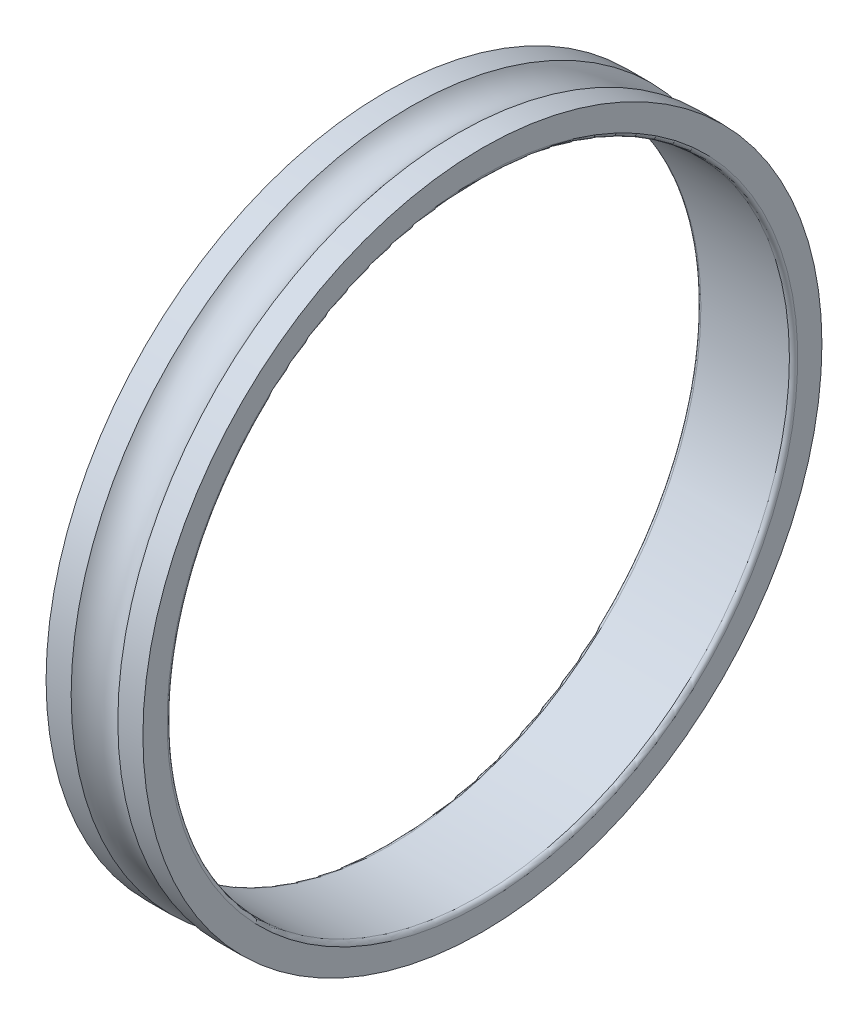
ISO-10303-21;
HEADER;
FILE_DESCRIPTION(('STEP AP214'),'2;1');
FILE_NAME('part.step','',(''),(''),'','','');
FILE_SCHEMA(('AUTOMOTIVE_DESIGN { 1 0 10303 214 1 1 1 1 }'));
ENDSEC;
DATA;
#1=APPLICATION_CONTEXT('core data for automotive mechanical design processes');
#2=APPLICATION_PROTOCOL_DEFINITION('international standard','automotive_design',2000,#1);
#3=PRODUCT_CONTEXT('',#1,'mechanical');
#4=PRODUCT('Part','Part','',(#3));
#5=PRODUCT_RELATED_PRODUCT_CATEGORY('part','',(#4));
#6=PRODUCT_DEFINITION_FORMATION('','',#4);
#7=PRODUCT_DEFINITION_CONTEXT('part definition',#1,'design');
#8=PRODUCT_DEFINITION('design','',#6,#7);
#9=PRODUCT_DEFINITION_SHAPE('','',#8);
#10=(LENGTH_UNIT() NAMED_UNIT(*) SI_UNIT(.MILLI.,.METRE.));
#11=(NAMED_UNIT(*) PLANE_ANGLE_UNIT() SI_UNIT($,.RADIAN.));
#12=(NAMED_UNIT(*) SI_UNIT($,.STERADIAN.) SOLID_ANGLE_UNIT());
#13=UNCERTAINTY_MEASURE_WITH_UNIT(LENGTH_MEASURE(1.E-05),#10,'distance_accuracy_value','');
#14=(GEOMETRIC_REPRESENTATION_CONTEXT(3) GLOBAL_UNCERTAINTY_ASSIGNED_CONTEXT((#13)) GLOBAL_UNIT_ASSIGNED_CONTEXT((#10,
#11,#12)) REPRESENTATION_CONTEXT('',''));
#15=CARTESIAN_POINT('',(0.,0.,0.));
#16=DIRECTION('',(0.,0.,1.));
#17=DIRECTION('',(1.,0.,0.));
#18=AXIS2_PLACEMENT_3D('',#15,#16,#17);
#19=CARTESIAN_POINT('',(3.5,0.,0.));
#20=DIRECTION('',(-1.,0.,0.));
#21=DIRECTION('',(0.,-1.,0.));
#22=AXIS2_PLACEMENT_3D('',#19,#20,#21);
#23=TOROIDAL_SURFACE('',#22,25.8,2.1);
#24=CARTESIAN_POINT('',(5.18745370306862,0.,0.));
#25=DIRECTION('',(1.,0.,0.));
#26=DIRECTION('',(0.,0.,-1.));
#27=AXIS2_PLACEMENT_3D('',#24,#25,#26);
#28=CIRCLE('',#27,24.55);
#29=CARTESIAN_POINT('',(5.18745370306862,0.,-24.55));
#30=VERTEX_POINT('',#29);
#31=EDGE_CURVE('E215',#30,#30,#28,.T.);
#32=ORIENTED_EDGE('',*,*,#31,.F.);
#33=EDGE_LOOP('',(#32));
#34=FACE_BOUND('',#33,.T.);
#35=CARTESIAN_POINT('',(1.81254629693138,0.,0.));
#36=DIRECTION('',(1.,0.,0.));
#37=DIRECTION('',(0.,0.,-1.));
#38=AXIS2_PLACEMENT_3D('',#35,#36,#37);
#39=CIRCLE('',#38,24.55);
#40=CARTESIAN_POINT('',(1.81254629693138,0.,-24.55));
#41=VERTEX_POINT('',#40);
#42=EDGE_CURVE('E212',#41,#41,#39,.F.);
#43=ORIENTED_EDGE('',*,*,#42,.F.);
#44=EDGE_LOOP('',(#43));
#45=FACE_BOUND('',#44,.T.);
#46=ADVANCED_FACE('F16',(#34,#45),#23,.F.);
#47=CARTESIAN_POINT('',(6.09372685153431,0.,0.));
#48=DIRECTION('',(1.,0.,0.));
#49=DIRECTION('',(0.,0.,-1.));
#50=AXIS2_PLACEMENT_3D('',#47,#48,#49);
#51=CYLINDRICAL_SURFACE('',#50,24.55);
#52=ORIENTED_EDGE('',*,*,#31,.T.);
#53=EDGE_LOOP('',(#52));
#54=FACE_BOUND('',#53,.T.);
#55=CARTESIAN_POINT('',(7.,0.,0.));
#56=DIRECTION('',(1.,0.,0.));
#57=DIRECTION('',(0.,0.,-1.));
#58=AXIS2_PLACEMENT_3D('',#55,#56,#57);
#59=CIRCLE('',#58,24.55);
#60=CARTESIAN_POINT('',(7.,0.,-24.55));
#61=VERTEX_POINT('',#60);
#62=EDGE_CURVE('E194',#61,#61,#59,.T.);
#63=ORIENTED_EDGE('',*,*,#62,.F.);
#64=EDGE_LOOP('',(#63));
#65=FACE_BOUND('',#64,.T.);
#66=ADVANCED_FACE('F78',(#54,#65),#51,.T.);
#67=CARTESIAN_POINT('',(0.90627314846569,0.,0.));
#68=DIRECTION('',(1.,0.,0.));
#69=DIRECTION('',(0.,0.,-1.));
#70=AXIS2_PLACEMENT_3D('',#67,#68,#69);
#71=CYLINDRICAL_SURFACE('',#70,24.55);
#72=CARTESIAN_POINT('',(0.,0.,0.));
#73=DIRECTION('',(1.,0.,0.));
#74=DIRECTION('',(0.,0.,-1.));
#75=AXIS2_PLACEMENT_3D('',#72,#73,#74);
#76=CIRCLE('',#75,24.55);
#77=CARTESIAN_POINT('',(0.,0.,-24.55));
#78=VERTEX_POINT('',#77);
#79=EDGE_CURVE('E56',#78,#78,#76,.F.);
#80=ORIENTED_EDGE('',*,*,#79,.F.);
#81=EDGE_LOOP('',(#80));
#82=FACE_BOUND('',#81,.T.);
#83=ORIENTED_EDGE('',*,*,#42,.T.);
#84=EDGE_LOOP('',(#83));
#85=FACE_BOUND('',#84,.T.);
#86=ADVANCED_FACE('F73',(#82,#85),#71,.T.);
#87=CARTESIAN_POINT('',(7.,0.,23.675));
#88=DIRECTION('',(1.,0.,0.));
#89=DIRECTION('',(0.,0.,-1.));
#90=AXIS2_PLACEMENT_3D('',#87,#88,#89);
#91=PLANE('',#90);
#92=CARTESIAN_POINT('',(7.,0.,0.));
#93=DIRECTION('',(1.,0.,0.));
#94=DIRECTION('',(0.,-1.,0.));
#95=AXIS2_PLACEMENT_3D('',#92,#93,#94);
#96=CIRCLE('',#95,22.8);
#97=CARTESIAN_POINT('',(7.,-22.8,0.));
#98=VERTEX_POINT('',#97);
#99=CARTESIAN_POINT('',(7.,22.8,0.));
#100=VERTEX_POINT('',#99);
#101=EDGE_CURVE('E44',#98,#100,#96,.T.);
#102=ORIENTED_EDGE('',*,*,#101,.F.);
#103=CARTESIAN_POINT('',(7.,0.,0.));
#104=DIRECTION('',(1.,0.,0.));
#105=DIRECTION('',(0.,1.,0.));
#106=AXIS2_PLACEMENT_3D('',#103,#104,#105);
#107=CIRCLE('',#106,22.8);
#108=EDGE_CURVE('E41',#100,#98,#107,.T.);
#109=ORIENTED_EDGE('',*,*,#108,.F.);
#110=EDGE_LOOP('',(#102,#109));
#111=FACE_BOUND('',#110,.T.);
#112=ORIENTED_EDGE('',*,*,#62,.T.);
#113=EDGE_LOOP('',(#112));
#114=FACE_BOUND('',#113,.T.);
#115=ADVANCED_FACE('F54',(#111,#114),#91,.T.);
#116=CARTESIAN_POINT('',(0.,0.,23.675));
#117=DIRECTION('',(-1.,0.,0.));
#118=DIRECTION('',(0.,0.,1.));
#119=AXIS2_PLACEMENT_3D('',#116,#117,#118);
#120=PLANE('',#119);
#121=CARTESIAN_POINT('',(0.,0.,0.));
#122=DIRECTION('',(-1.,0.,0.));
#123=DIRECTION('',(0.,-1.,0.));
#124=AXIS2_PLACEMENT_3D('',#121,#122,#123);
#125=CIRCLE('',#124,22.8);
#126=CARTESIAN_POINT('',(0.,-22.8,0.));
#127=VERTEX_POINT('',#126);
#128=CARTESIAN_POINT('',(0.,22.8,0.));
#129=VERTEX_POINT('',#128);
#130=EDGE_CURVE('E32',#127,#129,#125,.T.);
#131=ORIENTED_EDGE('',*,*,#130,.F.);
#132=CARTESIAN_POINT('',(0.,0.,0.));
#133=DIRECTION('',(-1.,0.,0.));
#134=DIRECTION('',(0.,1.,0.));
#135=AXIS2_PLACEMENT_3D('',#132,#133,#134);
#136=CIRCLE('',#135,22.8);
#137=EDGE_CURVE('E50',#129,#127,#136,.T.);
#138=ORIENTED_EDGE('',*,*,#137,.F.);
#139=EDGE_LOOP('',(#131,#138));
#140=FACE_BOUND('',#139,.T.);
#141=ORIENTED_EDGE('',*,*,#79,.T.);
#142=EDGE_LOOP('',(#141));
#143=FACE_BOUND('',#142,.T.);
#144=ADVANCED_FACE('F72',(#140,#143),#120,.T.);
#145=CARTESIAN_POINT('',(6.7,0.,0.));
#146=DIRECTION('',(-1.,0.,0.));
#147=DIRECTION('',(0.,-1.,0.));
#148=AXIS2_PLACEMENT_3D('',#145,#146,#147);
#149=TOROIDAL_SURFACE('',#148,22.8,0.300000000000002);
#150=ORIENTED_EDGE('',*,*,#108,.T.);
#151=ORIENTED_EDGE('',*,*,#101,.T.);
#152=EDGE_LOOP('',(#150,#151));
#153=FACE_BOUND('',#152,.T.);
#154=CARTESIAN_POINT('',(6.7,0.,0.));
#155=DIRECTION('',(1.,0.,0.));
#156=DIRECTION('',(0.,0.,-1.));
#157=AXIS2_PLACEMENT_3D('',#154,#155,#156);
#158=CIRCLE('',#157,22.5);
#159=CARTESIAN_POINT('',(6.7,0.,-22.5));
#160=VERTEX_POINT('',#159);
#161=EDGE_CURVE('E20',#160,#160,#158,.F.);
#162=ORIENTED_EDGE('',*,*,#161,.T.);
#163=EDGE_LOOP('',(#162));
#164=FACE_BOUND('',#163,.T.);
#165=ADVANCED_FACE('F46',(#153,#164),#149,.T.);
#166=CARTESIAN_POINT('',(0.300000000000001,0.,0.));
#167=DIRECTION('',(-1.,0.,0.));
#168=DIRECTION('',(0.,-1.,0.));
#169=AXIS2_PLACEMENT_3D('',#166,#167,#168);
#170=TOROIDAL_SURFACE('',#169,22.8,0.300000000000001);
#171=ORIENTED_EDGE('',*,*,#137,.T.);
#172=ORIENTED_EDGE('',*,*,#130,.T.);
#173=EDGE_LOOP('',(#171,#172));
#174=FACE_BOUND('',#173,.T.);
#175=CARTESIAN_POINT('',(0.3,0.,0.));
#176=DIRECTION('',(1.,0.,0.));
#177=DIRECTION('',(0.,0.,-1.));
#178=AXIS2_PLACEMENT_3D('',#175,#176,#177);
#179=CIRCLE('',#178,22.5);
#180=CARTESIAN_POINT('',(0.3,0.,-22.5));
#181=VERTEX_POINT('',#180);
#182=EDGE_CURVE('E11',#181,#181,#179,.T.);
#183=ORIENTED_EDGE('',*,*,#182,.T.);
#184=EDGE_LOOP('',(#183));
#185=FACE_BOUND('',#184,.T.);
#186=ADVANCED_FACE('F91',(#174,#185),#170,.T.);
#187=CARTESIAN_POINT('',(3.5,0.,0.));
#188=DIRECTION('',(1.,0.,0.));
#189=DIRECTION('',(0.,0.,-1.));
#190=AXIS2_PLACEMENT_3D('',#187,#188,#189);
#191=CYLINDRICAL_SURFACE('',#190,22.5);
#192=ORIENTED_EDGE('',*,*,#182,.F.);
#193=EDGE_LOOP('',(#192));
#194=FACE_BOUND('',#193,.T.);
#195=ORIENTED_EDGE('',*,*,#161,.F.);
#196=EDGE_LOOP('',(#195));
#197=FACE_BOUND('',#196,.T.);
#198=ADVANCED_FACE('F89',(#194,#197),#191,.F.);
#199=CLOSED_SHELL('',(#46,#66,#86,#115,#144,#165,#186,#198));
#200=MANIFOLD_SOLID_BREP('B1',#199);
#201=ADVANCED_BREP_SHAPE_REPRESENTATION('',(#18,#200),#14);
#202=SHAPE_DEFINITION_REPRESENTATION(#9,#201);
ENDSEC;
END-ISO-10303-21;
